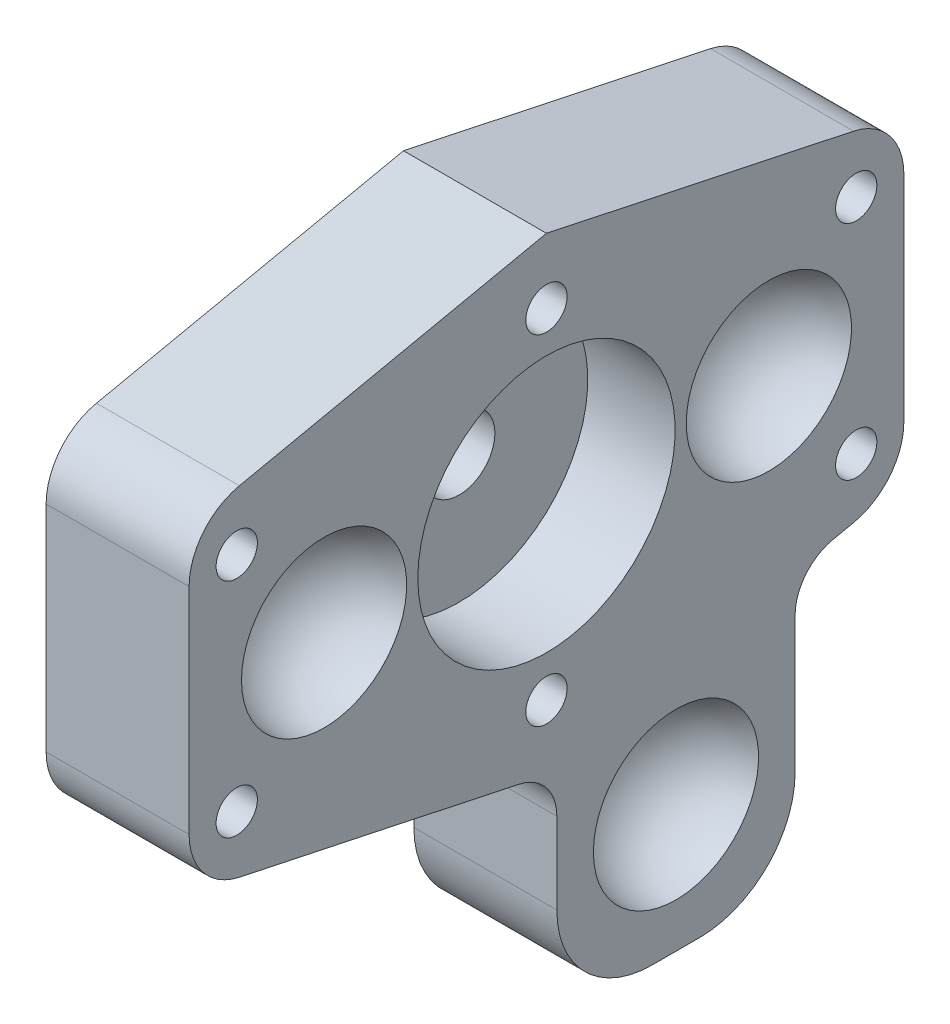
ISO-10303-21;
HEADER;
FILE_DESCRIPTION(('STEP AP214'),'2;1');
FILE_NAME('part.step','',(''),(''),'','','');
FILE_SCHEMA(('AUTOMOTIVE_DESIGN { 1 0 10303 214 1 1 1 1 }'));
ENDSEC;
DATA;
#1=APPLICATION_CONTEXT('core data for automotive mechanical design processes');
#2=APPLICATION_PROTOCOL_DEFINITION('international standard','automotive_design',2000,#1);
#3=PRODUCT_CONTEXT('',#1,'mechanical');
#4=PRODUCT('Part','Part','',(#3));
#5=PRODUCT_RELATED_PRODUCT_CATEGORY('part','',(#4));
#6=PRODUCT_DEFINITION_FORMATION('','',#4);
#7=PRODUCT_DEFINITION_CONTEXT('part definition',#1,'design');
#8=PRODUCT_DEFINITION('design','',#6,#7);
#9=PRODUCT_DEFINITION_SHAPE('','',#8);
#10=(LENGTH_UNIT() NAMED_UNIT(*) SI_UNIT(.MILLI.,.METRE.));
#11=(NAMED_UNIT(*) PLANE_ANGLE_UNIT() SI_UNIT($,.RADIAN.));
#12=(NAMED_UNIT(*) SI_UNIT($,.STERADIAN.) SOLID_ANGLE_UNIT());
#13=UNCERTAINTY_MEASURE_WITH_UNIT(LENGTH_MEASURE(1.E-05),#10,'distance_accuracy_value','');
#14=(GEOMETRIC_REPRESENTATION_CONTEXT(3) GLOBAL_UNCERTAINTY_ASSIGNED_CONTEXT((#13)) GLOBAL_UNIT_ASSIGNED_CONTEXT((#10,
#11,#12)) REPRESENTATION_CONTEXT('',''));
#15=CARTESIAN_POINT('',(0.,0.,0.));
#16=DIRECTION('',(0.,0.,1.));
#17=DIRECTION('',(1.,0.,0.));
#18=AXIS2_PLACEMENT_3D('',#15,#16,#17);
#19=CARTESIAN_POINT('',(-9.,-28.2690306373786,-5.99265255801159));
#20=DIRECTION('',(0.,0.978260869565217,0.207378087264553));
#21=DIRECTION('',(0.,-0.207378087264554,0.978260869565218));
#22=AXIS2_PLACEMENT_3D('',#19,#20,#21);
#23=PLANE('',#22);
#24=DIRECTION('',(0.,0.207378087264554,-0.978260869565218));
#25=VECTOR('',#24,1.);
#26=CARTESIAN_POINT('',(-9.,-28.2690306373786,-5.99265255801159));
#27=LINE('',#26,#25);
#28=CARTESIAN_POINT('',(-9.,-20.9475712012116,-40.5300396512498));
#29=VERTEX_POINT('',#28);
#30=CARTESIAN_POINT('',(-9.,-20.672100546187,-41.8295123490582));
#31=VERTEX_POINT('',#30);
#32=EDGE_CURVE('E195',#29,#31,#27,.T.);
#33=ORIENTED_EDGE('',*,*,#32,.T.);
#34=DIRECTION('',(1.,0.,0.));
#35=VECTOR('',#34,1.);
#36=CARTESIAN_POINT('',(-9.,-20.672100546187,-41.8295123490582));
#37=LINE('',#36,#35);
#38=CARTESIAN_POINT('',(0.,-20.672100546187,-41.8295123490582));
#39=VERTEX_POINT('',#38);
#40=EDGE_CURVE('E279',#39,#31,#37,.F.);
#41=ORIENTED_EDGE('',*,*,#40,.F.);
#42=DIRECTION('',(0.,0.207378087264554,-0.978260869565218));
#43=VECTOR('',#42,1.);
#44=CARTESIAN_POINT('',(0.,-28.2690306373786,-5.99265255801159));
#45=LINE('',#44,#43);
#46=CARTESIAN_POINT('',(0.,-20.9475712012116,-40.5300396512498));
#47=VERTEX_POINT('',#46);
#48=EDGE_CURVE('E228',#47,#39,#45,.T.);
#49=ORIENTED_EDGE('',*,*,#48,.F.);
#50=DIRECTION('',(-1.,0.,0.));
#51=VECTOR('',#50,1.);
#52=CARTESIAN_POINT('',(-9.,-20.9475712012116,-40.5300396512498));
#53=LINE('',#52,#51);
#54=EDGE_CURVE('E303',#29,#47,#53,.F.);
#55=ORIENTED_EDGE('',*,*,#54,.F.);
#56=EDGE_LOOP('',(#33,#41,#49,#55));
#57=FACE_BOUND('',#56,.T.);
#58=ADVANCED_FACE('F37',(#57),#23,.F.);
#59=CARTESIAN_POINT('',(-9.,0.,-45.));
#60=DIRECTION('',(0.,0.,-1.));
#61=DIRECTION('',(1.,0.,0.));
#62=AXIS2_PLACEMENT_3D('',#59,#60,#61);
#63=PLANE('',#62);
#64=DIRECTION('',(0.,-1.,0.));
#65=VECTOR('',#64,1.);
#66=CARTESIAN_POINT('',(-9.,0.,-45.));
#67=LINE('',#66,#65);
#68=CARTESIAN_POINT('',(-9.,-3.24094293207383,-45.));
#69=VERTEX_POINT('',#68);
#70=CARTESIAN_POINT('',(-9.,-16.7590570679262,-45.));
#71=VERTEX_POINT('',#70);
#72=EDGE_CURVE('E183',#69,#71,#67,.T.);
#73=ORIENTED_EDGE('',*,*,#72,.F.);
#74=DIRECTION('',(1.,0.,0.));
#75=VECTOR('',#74,1.);
#76=CARTESIAN_POINT('',(-9.,-3.24094293207383,-45.));
#77=LINE('',#76,#75);
#78=CARTESIAN_POINT('',(0.,-3.24094293207383,-45.));
#79=VERTEX_POINT('',#78);
#80=EDGE_CURVE('E265',#79,#69,#77,.F.);
#81=ORIENTED_EDGE('',*,*,#80,.F.);
#82=DIRECTION('',(0.,-1.,0.));
#83=VECTOR('',#82,1.);
#84=CARTESIAN_POINT('',(0.,0.,-45.));
#85=LINE('',#84,#83);
#86=CARTESIAN_POINT('',(0.,-16.7590570679262,-45.));
#87=VERTEX_POINT('',#86);
#88=EDGE_CURVE('E215',#79,#87,#85,.T.);
#89=ORIENTED_EDGE('',*,*,#88,.T.);
#90=DIRECTION('',(1.,0.,0.));
#91=VECTOR('',#90,1.);
#92=CARTESIAN_POINT('',(0.,-16.7590570679262,-45.));
#93=LINE('',#92,#91);
#94=EDGE_CURVE('E268',#71,#87,#93,.T.);
#95=ORIENTED_EDGE('',*,*,#94,.F.);
#96=EDGE_LOOP('',(#73,#81,#89,#95));
#97=FACE_BOUND('',#96,.T.);
#98=ADVANCED_FACE('F338',(#97),#63,.T.);
#99=CARTESIAN_POINT('',(-9.,9.12914405892871,-1.93525519848772));
#100=DIRECTION('',(0.,0.978260869565217,-0.207378087264554));
#101=DIRECTION('',(0.,0.207378087264554,0.978260869565218));
#102=AXIS2_PLACEMENT_3D('',#99,#100,#101);
#103=PLANE('',#102);
#104=DIRECTION('',(0.,-0.207378087264554,-0.978260869565218));
#105=VECTOR('',#104,1.);
#106=CARTESIAN_POINT('',(-9.,9.12914405892871,-1.93525519848772));
#107=LINE('',#106,#105);
#108=CARTESIAN_POINT('',(-9.,4.76969600708473,-22.5));
#109=VERTEX_POINT('',#108);
#110=CARTESIAN_POINT('',(-9.,0.672100546187042,-41.8295123490582));
#111=VERTEX_POINT('',#110);
#112=EDGE_CURVE('E160',#109,#111,#107,.T.);
#113=ORIENTED_EDGE('',*,*,#112,.F.);
#114=DIRECTION('',(1.,0.,0.));
#115=VECTOR('',#114,1.);
#116=CARTESIAN_POINT('',(-9.,4.76969600708473,-22.5));
#117=LINE('',#116,#115);
#118=CARTESIAN_POINT('',(0.,4.76969600708473,-22.5));
#119=VERTEX_POINT('',#118);
#120=EDGE_CURVE('E169',#109,#119,#117,.T.);
#121=ORIENTED_EDGE('',*,*,#120,.T.);
#122=DIRECTION('',(0.,-0.207378087264554,-0.978260869565218));
#123=VECTOR('',#122,1.);
#124=CARTESIAN_POINT('',(0.,9.12914405892871,-1.93525519848772));
#125=LINE('',#124,#123);
#126=CARTESIAN_POINT('',(0.,0.672100546187042,-41.8295123490582));
#127=VERTEX_POINT('',#126);
#128=EDGE_CURVE('E219',#119,#127,#125,.T.);
#129=ORIENTED_EDGE('',*,*,#128,.T.);
#130=DIRECTION('',(1.,0.,0.));
#131=VECTOR('',#130,1.);
#132=CARTESIAN_POINT('',(-9.,0.672100546187042,-41.8295123490582));
#133=LINE('',#132,#131);
#134=EDGE_CURVE('E182',#111,#127,#133,.T.);
#135=ORIENTED_EDGE('',*,*,#134,.F.);
#136=EDGE_LOOP('',(#113,#121,#129,#135));
#137=FACE_BOUND('',#136,.T.);
#138=ADVANCED_FACE('F180',(#137),#103,.T.);
#139=CARTESIAN_POINT('',(-9.,0.,0.));
#140=DIRECTION('',(0.,-0.978260869565217,-0.207378087264554));
#141=DIRECTION('',(0.,0.207378087264554,-0.978260869565218));
#142=AXIS2_PLACEMENT_3D('',#139,#140,#141);
#143=PLANE('',#142);
#144=DIRECTION('',(0.,-0.207378087264554,0.978260869565218));
#145=VECTOR('',#144,1.);
#146=CARTESIAN_POINT('',(0.,0.,0.));
#147=LINE('',#146,#145);
#148=CARTESIAN_POINT('',(0.,0.672100546187044,-3.17048765094179));
#149=VERTEX_POINT('',#148);
#150=EDGE_CURVE('E172',#119,#149,#147,.T.);
#151=ORIENTED_EDGE('',*,*,#150,.F.);
#152=ORIENTED_EDGE('',*,*,#120,.F.);
#153=DIRECTION('',(0.,-0.207378087264554,0.978260869565218));
#154=VECTOR('',#153,1.);
#155=CARTESIAN_POINT('',(-9.,0.,0.));
#156=LINE('',#155,#154);
#157=CARTESIAN_POINT('',(-9.,0.672100546187044,-3.17048765094179));
#158=VERTEX_POINT('',#157);
#159=EDGE_CURVE('E154',#109,#158,#156,.T.);
#160=ORIENTED_EDGE('',*,*,#159,.T.);
#161=DIRECTION('',(1.,0.,0.));
#162=VECTOR('',#161,1.);
#163=CARTESIAN_POINT('',(-9.,0.672100546187044,-3.17048765094179));
#164=LINE('',#163,#162);
#165=EDGE_CURVE('E296',#149,#158,#164,.F.);
#166=ORIENTED_EDGE('',*,*,#165,.F.);
#167=EDGE_LOOP('',(#151,#152,#160,#166));
#168=FACE_BOUND('',#167,.T.);
#169=ADVANCED_FACE('F170',(#168),#143,.F.);
#170=CARTESIAN_POINT('',(-9.,0.,0.));
#171=DIRECTION('',(0.,0.,-1.));
#172=DIRECTION('',(0.,1.,0.));
#173=AXIS2_PLACEMENT_3D('',#170,#171,#172);
#174=PLANE('',#173);
#175=DIRECTION('',(0.,-1.,0.));
#176=VECTOR('',#175,1.);
#177=CARTESIAN_POINT('',(-9.,0.,0.));
#178=LINE('',#177,#176);
#179=CARTESIAN_POINT('',(-9.,-3.24094293207383,0.));
#180=VERTEX_POINT('',#179);
#181=CARTESIAN_POINT('',(-9.,-16.7590570679262,0.));
#182=VERTEX_POINT('',#181);
#183=EDGE_CURVE('E166',#180,#182,#178,.T.);
#184=ORIENTED_EDGE('',*,*,#183,.T.);
#185=DIRECTION('',(1.,0.,0.));
#186=VECTOR('',#185,1.);
#187=CARTESIAN_POINT('',(-9.,-16.7590570679262,0.));
#188=LINE('',#187,#186);
#189=CARTESIAN_POINT('',(0.,-16.7590570679262,0.));
#190=VERTEX_POINT('',#189);
#191=EDGE_CURVE('E290',#190,#182,#188,.F.);
#192=ORIENTED_EDGE('',*,*,#191,.F.);
#193=DIRECTION('',(0.,-1.,0.));
#194=VECTOR('',#193,1.);
#195=CARTESIAN_POINT('',(0.,0.,0.));
#196=LINE('',#195,#194);
#197=CARTESIAN_POINT('',(0.,-3.24094293207383,0.));
#198=VERTEX_POINT('',#197);
#199=EDGE_CURVE('E222',#198,#190,#196,.T.);
#200=ORIENTED_EDGE('',*,*,#199,.F.);
#201=DIRECTION('',(1.,0.,0.));
#202=VECTOR('',#201,1.);
#203=CARTESIAN_POINT('',(-9.,-3.24094293207383,0.));
#204=LINE('',#203,#202);
#205=EDGE_CURVE('E293',#180,#198,#204,.T.);
#206=ORIENTED_EDGE('',*,*,#205,.F.);
#207=EDGE_LOOP('',(#184,#192,#200,#206));
#208=FACE_BOUND('',#207,.T.);
#209=ADVANCED_FACE('F324',(#208),#174,.F.);
#210=CARTESIAN_POINT('',(-9.,-19.1398865784499,4.05739735952387));
#211=DIRECTION('',(0.,0.978260869565217,-0.207378087264553));
#212=DIRECTION('',(0.,0.207378087264554,0.978260869565218));
#213=AXIS2_PLACEMENT_3D('',#210,#211,#212);
#214=PLANE('',#213);
#215=DIRECTION('',(0.,-0.207378087264554,-0.978260869565218));
#216=VECTOR('',#215,1.);
#217=CARTESIAN_POINT('',(0.,-19.1398865784499,4.05739735952387));
#218=LINE('',#217,#216);
#219=CARTESIAN_POINT('',(0.,-20.672100546187,-3.17048765094179));
#220=VERTEX_POINT('',#219);
#221=CARTESIAN_POINT('',(0.,-24.4038726556208,-20.7743081748371));
#222=VERTEX_POINT('',#221);
#223=EDGE_CURVE('E225',#220,#222,#218,.T.);
#224=ORIENTED_EDGE('',*,*,#223,.F.);
#225=DIRECTION('',(1.,0.,0.));
#226=VECTOR('',#225,1.);
#227=CARTESIAN_POINT('',(-9.,-20.672100546187,-3.17048765094179));
#228=LINE('',#227,#226);
#229=CARTESIAN_POINT('',(-9.,-20.672100546187,-3.17048765094179));
#230=VERTEX_POINT('',#229);
#231=EDGE_CURVE('E298',#230,#220,#228,.T.);
#232=ORIENTED_EDGE('',*,*,#231,.F.);
#233=DIRECTION('',(0.,-0.207378087264554,-0.978260869565218));
#234=VECTOR('',#233,1.);
#235=CARTESIAN_POINT('',(-9.,-19.1398865784499,4.05739735952387));
#236=LINE('',#235,#234);
#237=CARTESIAN_POINT('',(-9.,-24.4038726556208,-20.7743081748371));
#238=VERTEX_POINT('',#237);
#239=EDGE_CURVE('E192',#230,#238,#236,.T.);
#240=ORIENTED_EDGE('',*,*,#239,.T.);
#241=DIRECTION('',(1.,0.,0.));
#242=VECTOR('',#241,1.);
#243=CARTESIAN_POINT('',(-9.,-24.4038726556208,-20.7743081748371));
#244=LINE('',#243,#242);
#245=EDGE_CURVE('E313',#222,#238,#244,.F.);
#246=ORIENTED_EDGE('',*,*,#245,.F.);
#247=EDGE_LOOP('',(#224,#232,#240,#246));
#248=FACE_BOUND('',#247,.T.);
#249=ADVANCED_FACE('F317',(#248),#214,.F.);
#250=CARTESIAN_POINT('',(-9.,-17.0000000000008,-3.));
#251=DIRECTION('',(1.,0.,0.));
#252=DIRECTION('',(0.,0.,1.));
#253=AXIS2_PLACEMENT_3D('',#250,#251,#252);
#254=CYLINDRICAL_SURFACE('',#253,1.3);
#255=CARTESIAN_POINT('',(-9.,-17.0000000000008,-3.));
#256=DIRECTION('',(1.,0.,0.));
#257=DIRECTION('',(0.,0.,-1.));
#258=AXIS2_PLACEMENT_3D('',#255,#256,#257);
#259=CIRCLE('',#258,1.3);
#260=CARTESIAN_POINT('',(-9.,-17.0000000000008,-4.3));
#261=VERTEX_POINT('',#260);
#262=EDGE_CURVE('E207',#261,#261,#259,.T.);
#263=ORIENTED_EDGE('',*,*,#262,.F.);
#264=EDGE_LOOP('',(#263));
#265=FACE_BOUND('',#264,.T.);
#266=CARTESIAN_POINT('',(0.,-17.0000000000008,-3.));
#267=DIRECTION('',(1.,0.,0.));
#268=DIRECTION('',(0.,0.,-1.));
#269=AXIS2_PLACEMENT_3D('',#266,#267,#268);
#270=CIRCLE('',#269,1.3);
#271=CARTESIAN_POINT('',(0.,-17.0000000000008,-4.3));
#272=VERTEX_POINT('',#271);
#273=EDGE_CURVE('E240',#272,#272,#270,.T.);
#274=ORIENTED_EDGE('',*,*,#273,.T.);
#275=EDGE_LOOP('',(#274));
#276=FACE_BOUND('',#275,.T.);
#277=ADVANCED_FACE('F420',(#265,#276),#254,.F.);
#278=CARTESIAN_POINT('',(-9.,-3.00000000000081,-2.99999999999995));
#279=DIRECTION('',(1.,0.,0.));
#280=DIRECTION('',(0.,0.,1.));
#281=AXIS2_PLACEMENT_3D('',#278,#279,#280);
#282=CYLINDRICAL_SURFACE('',#281,1.3);
#283=CARTESIAN_POINT('',(-9.,-3.00000000000081,-2.99999999999995));
#284=DIRECTION('',(1.,0.,0.));
#285=DIRECTION('',(0.,0.,-1.));
#286=AXIS2_PLACEMENT_3D('',#283,#284,#285);
#287=CIRCLE('',#286,1.3);
#288=CARTESIAN_POINT('',(-9.,-3.00000000000081,-4.29999999999995));
#289=VERTEX_POINT('',#288);
#290=EDGE_CURVE('E204',#289,#289,#287,.T.);
#291=ORIENTED_EDGE('',*,*,#290,.F.);
#292=EDGE_LOOP('',(#291));
#293=FACE_BOUND('',#292,.T.);
#294=CARTESIAN_POINT('',(0.,-3.00000000000081,-2.99999999999995));
#295=DIRECTION('',(1.,0.,0.));
#296=DIRECTION('',(0.,0.,-1.));
#297=AXIS2_PLACEMENT_3D('',#294,#295,#296);
#298=CIRCLE('',#297,1.3);
#299=CARTESIAN_POINT('',(0.,-3.00000000000081,-4.29999999999995));
#300=VERTEX_POINT('',#299);
#301=EDGE_CURVE('E237',#300,#300,#298,.T.);
#302=ORIENTED_EDGE('',*,*,#301,.T.);
#303=EDGE_LOOP('',(#302));
#304=FACE_BOUND('',#303,.T.);
#305=ADVANCED_FACE('F635',(#293,#304),#282,.F.);
#306=CARTESIAN_POINT('',(-9.,-3.,-42.));
#307=DIRECTION('',(1.,0.,0.));
#308=DIRECTION('',(0.,0.,1.));
#309=AXIS2_PLACEMENT_3D('',#306,#307,#308);
#310=CYLINDRICAL_SURFACE('',#309,1.3);
#311=CARTESIAN_POINT('',(-9.,-3.,-42.));
#312=DIRECTION('',(1.,0.,0.));
#313=DIRECTION('',(0.,0.,-1.));
#314=AXIS2_PLACEMENT_3D('',#311,#312,#313);
#315=CIRCLE('',#314,1.3);
#316=CARTESIAN_POINT('',(-9.,-3.,-43.2999999999999));
#317=VERTEX_POINT('',#316);
#318=EDGE_CURVE('E201',#317,#317,#315,.T.);
#319=ORIENTED_EDGE('',*,*,#318,.F.);
#320=EDGE_LOOP('',(#319));
#321=FACE_BOUND('',#320,.T.);
#322=CARTESIAN_POINT('',(0.,-3.,-42.));
#323=DIRECTION('',(1.,0.,0.));
#324=DIRECTION('',(0.,0.,-1.));
#325=AXIS2_PLACEMENT_3D('',#322,#323,#324);
#326=CIRCLE('',#325,1.3);
#327=CARTESIAN_POINT('',(0.,-3.,-43.2999999999999));
#328=VERTEX_POINT('',#327);
#329=EDGE_CURVE('E234',#328,#328,#326,.T.);
#330=ORIENTED_EDGE('',*,*,#329,.T.);
#331=EDGE_LOOP('',(#330));
#332=FACE_BOUND('',#331,.T.);
#333=ADVANCED_FACE('F626',(#321,#332),#310,.F.);
#334=CARTESIAN_POINT('',(-9.,0.680807118195843,-22.5));
#335=DIRECTION('',(1.,0.,0.));
#336=DIRECTION('',(0.,0.,1.));
#337=AXIS2_PLACEMENT_3D('',#334,#335,#336);
#338=CYLINDRICAL_SURFACE('',#337,1.3);
#339=CARTESIAN_POINT('',(-9.,0.680807118195843,-22.5));
#340=DIRECTION('',(1.,0.,0.));
#341=DIRECTION('',(0.,0.,-1.));
#342=AXIS2_PLACEMENT_3D('',#339,#340,#341);
#343=CIRCLE('',#342,1.3);
#344=CARTESIAN_POINT('',(-9.,0.680807118195843,-23.8));
#345=VERTEX_POINT('',#344);
#346=EDGE_CURVE('E198',#345,#345,#343,.T.);
#347=ORIENTED_EDGE('',*,*,#346,.F.);
#348=EDGE_LOOP('',(#347));
#349=FACE_BOUND('',#348,.T.);
#350=CARTESIAN_POINT('',(0.,0.680807118195843,-22.5));
#351=DIRECTION('',(1.,0.,0.));
#352=DIRECTION('',(0.,0.,-1.));
#353=AXIS2_PLACEMENT_3D('',#350,#351,#352);
#354=CIRCLE('',#353,1.3);
#355=CARTESIAN_POINT('',(0.,0.680807118195843,-23.8));
#356=VERTEX_POINT('',#355);
#357=EDGE_CURVE('E231',#356,#356,#354,.T.);
#358=ORIENTED_EDGE('',*,*,#357,.T.);
#359=EDGE_LOOP('',(#358));
#360=FACE_BOUND('',#359,.T.);
#361=ADVANCED_FACE('F389',(#349,#360),#338,.F.);
#362=CARTESIAN_POINT('',(-9.,-20.6808071181958,-22.5));
#363=DIRECTION('',(1.,0.,0.));
#364=DIRECTION('',(0.,0.,1.));
#365=AXIS2_PLACEMENT_3D('',#362,#363,#364);
#366=CYLINDRICAL_SURFACE('',#365,1.3);
#367=CARTESIAN_POINT('',(-9.,-20.6808071181958,-22.5));
#368=DIRECTION('',(1.,0.,0.));
#369=DIRECTION('',(0.,0.,-1.));
#370=AXIS2_PLACEMENT_3D('',#367,#368,#369);
#371=CIRCLE('',#370,1.3);
#372=CARTESIAN_POINT('',(-9.,-20.6808071181958,-23.8));
#373=VERTEX_POINT('',#372);
#374=EDGE_CURVE('E186',#373,#373,#371,.T.);
#375=ORIENTED_EDGE('',*,*,#374,.F.);
#376=EDGE_LOOP('',(#375));
#377=FACE_BOUND('',#376,.T.);
#378=CARTESIAN_POINT('',(0.,-20.6808071181958,-22.5));
#379=DIRECTION('',(1.,0.,0.));
#380=DIRECTION('',(0.,0.,-1.));
#381=AXIS2_PLACEMENT_3D('',#378,#379,#380);
#382=CIRCLE('',#381,1.3);
#383=CARTESIAN_POINT('',(0.,-20.6808071181958,-23.8));
#384=VERTEX_POINT('',#383);
#385=EDGE_CURVE('E212',#384,#384,#382,.T.);
#386=ORIENTED_EDGE('',*,*,#385,.T.);
#387=EDGE_LOOP('',(#386));
#388=FACE_BOUND('',#387,.T.);
#389=ADVANCED_FACE('F385',(#377,#388),#366,.F.);
#390=CARTESIAN_POINT('',(-9.,-17.,-42.));
#391=DIRECTION('',(1.,0.,0.));
#392=DIRECTION('',(0.,0.,1.));
#393=AXIS2_PLACEMENT_3D('',#390,#391,#392);
#394=CYLINDRICAL_SURFACE('',#393,1.3);
#395=CARTESIAN_POINT('',(-9.,-17.,-42.));
#396=DIRECTION('',(1.,0.,0.));
#397=DIRECTION('',(0.,0.,-1.));
#398=AXIS2_PLACEMENT_3D('',#395,#396,#397);
#399=CIRCLE('',#398,1.3);
#400=CARTESIAN_POINT('',(-9.,-17.,-43.3));
#401=VERTEX_POINT('',#400);
#402=EDGE_CURVE('E177',#401,#401,#399,.T.);
#403=ORIENTED_EDGE('',*,*,#402,.F.);
#404=EDGE_LOOP('',(#403));
#405=FACE_BOUND('',#404,.T.);
#406=CARTESIAN_POINT('',(0.,-17.,-42.));
#407=DIRECTION('',(1.,0.,0.));
#408=DIRECTION('',(0.,0.,-1.));
#409=AXIS2_PLACEMENT_3D('',#406,#407,#408);
#410=CIRCLE('',#409,1.3);
#411=CARTESIAN_POINT('',(0.,-17.,-43.3));
#412=VERTEX_POINT('',#411);
#413=EDGE_CURVE('E243',#412,#412,#410,.T.);
#414=ORIENTED_EDGE('',*,*,#413,.T.);
#415=EDGE_LOOP('',(#414));
#416=FACE_BOUND('',#415,.T.);
#417=ADVANCED_FACE('F388',(#405,#416),#394,.F.);
#418=CARTESIAN_POINT('',(-9.,0.,0.));
#419=DIRECTION('',(-1.,0.,0.));
#420=DIRECTION('',(0.,0.,-1.));
#421=AXIS2_PLACEMENT_3D('',#418,#419,#420);
#422=PLANE('',#421);
#423=CARTESIAN_POINT('',(-9.,-10.,-22.5));
#424=DIRECTION('',(-1.,0.,0.));
#425=DIRECTION('',(0.,0.,1.));
#426=AXIS2_PLACEMENT_3D('',#423,#424,#425);
#427=CIRCLE('',#426,2.25);
#428=CARTESIAN_POINT('',(-9.,-10.,-20.25));
#429=VERTEX_POINT('',#428);
#430=EDGE_CURVE('E364',#429,#429,#427,.T.);
#431=ORIENTED_EDGE('',*,*,#430,.F.);
#432=EDGE_LOOP('',(#431));
#433=FACE_BOUND('',#432,.T.);
#434=ORIENTED_EDGE('',*,*,#374,.T.);
#435=EDGE_LOOP('',(#434));
#436=FACE_BOUND('',#435,.T.);
#437=DIRECTION('',(0.,1.,0.));
#438=VECTOR('',#437,1.);
#439=CARTESIAN_POINT('',(-9.,-21.4516466108519,-38.1521739130435));
#440=LINE('',#439,#438);
#441=CARTESIAN_POINT('',(-9.,-32.4516466108519,-38.1521739130435));
#442=VERTEX_POINT('',#441);
#443=CARTESIAN_POINT('',(-9.,-23.8823538099072,-38.1521739130435));
#444=VERTEX_POINT('',#443);
#445=EDGE_CURVE('E348',#442,#444,#440,.T.);
#446=ORIENTED_EDGE('',*,*,#445,.F.);
#447=CARTESIAN_POINT('',(-9.,-32.4516466108519,-32.1521739130435));
#448=DIRECTION('',(1.,0.,0.));
#449=DIRECTION('',(0.,0.,-1.));
#450=AXIS2_PLACEMENT_3D('',#447,#448,#449);
#451=CIRCLE('',#450,6.);
#452=CARTESIAN_POINT('',(-9.,-38.4516466108519,-32.1521739130435));
#453=VERTEX_POINT('',#452);
#454=EDGE_CURVE('E247',#453,#442,#451,.T.);
#455=ORIENTED_EDGE('',*,*,#454,.F.);
#456=DIRECTION('',(0.,0.,-1.));
#457=VECTOR('',#456,1.);
#458=CARTESIAN_POINT('',(-9.,-38.4516466108519,-38.1521739130435));
#459=LINE('',#458,#457);
#460=CARTESIAN_POINT('',(-9.,-38.4516466108519,-29.1521739130435));
#461=VERTEX_POINT('',#460);
#462=EDGE_CURVE('E354',#461,#453,#459,.T.);
#463=ORIENTED_EDGE('',*,*,#462,.F.);
#464=CARTESIAN_POINT('',(-9.,-32.4516466108519,-29.1521739130435));
#465=DIRECTION('',(1.,0.,0.));
#466=DIRECTION('',(0.,0.,-1.));
#467=AXIS2_PLACEMENT_3D('',#464,#465,#466);
#468=CIRCLE('',#467,6.);
#469=CARTESIAN_POINT('',(-9.,-32.4516466108519,-23.1521739130435));
#470=VERTEX_POINT('',#469);
#471=EDGE_CURVE('E250',#470,#461,#468,.T.);
#472=ORIENTED_EDGE('',*,*,#471,.F.);
#473=DIRECTION('',(0.,-1.,0.));
#474=VECTOR('',#473,1.);
#475=CARTESIAN_POINT('',(-9.,-38.4516466108519,-23.1521739130435));
#476=LINE('',#475,#474);
#477=CARTESIAN_POINT('',(-9.,-27.3386552643165,-23.1521739130435));
#478=VERTEX_POINT('',#477);
#479=EDGE_CURVE('E360',#478,#470,#476,.T.);
#480=ORIENTED_EDGE('',*,*,#479,.F.);
#481=CARTESIAN_POINT('',(-9.,-27.3386552643165,-20.1521739130435));
#482=DIRECTION('',(1.,0.,0.));
#483=DIRECTION('',(0.,0.,-1.));
#484=AXIS2_PLACEMENT_3D('',#481,#482,#483);
#485=CIRCLE('',#484,3.);
#486=EDGE_CURVE('E11',#238,#478,#485,.F.);
#487=ORIENTED_EDGE('',*,*,#486,.F.);
#488=ORIENTED_EDGE('',*,*,#239,.F.);
#489=CARTESIAN_POINT('',(-9.,-16.7590570679262,-4.));
#490=DIRECTION('',(1.,0.,0.));
#491=DIRECTION('',(0.,0.,-1.));
#492=AXIS2_PLACEMENT_3D('',#489,#490,#491);
#493=CIRCLE('',#492,4.);
#494=EDGE_CURVE('E282',#182,#230,#493,.T.);
#495=ORIENTED_EDGE('',*,*,#494,.F.);
#496=ORIENTED_EDGE('',*,*,#183,.F.);
#497=CARTESIAN_POINT('',(-9.,-3.24094293207383,-4.));
#498=DIRECTION('',(1.,0.,0.));
#499=DIRECTION('',(0.,0.,-1.));
#500=AXIS2_PLACEMENT_3D('',#497,#498,#499);
#501=CIRCLE('',#500,4.);
#502=EDGE_CURVE('E162',#158,#180,#501,.T.);
#503=ORIENTED_EDGE('',*,*,#502,.F.);
#504=ORIENTED_EDGE('',*,*,#159,.F.);
#505=ORIENTED_EDGE('',*,*,#112,.T.);
#506=CARTESIAN_POINT('',(-9.,-3.24094293207383,-41.));
#507=DIRECTION('',(1.,0.,0.));
#508=DIRECTION('',(0.,0.,-1.));
#509=AXIS2_PLACEMENT_3D('',#506,#507,#508);
#510=CIRCLE('',#509,4.);
#511=EDGE_CURVE('E285',#69,#111,#510,.T.);
#512=ORIENTED_EDGE('',*,*,#511,.F.);
#513=ORIENTED_EDGE('',*,*,#72,.T.);
#514=CARTESIAN_POINT('',(-9.,-16.7590570679262,-41.));
#515=DIRECTION('',(1.,0.,0.));
#516=DIRECTION('',(0.,0.,-1.));
#517=AXIS2_PLACEMENT_3D('',#514,#515,#516);
#518=CIRCLE('',#517,4.);
#519=EDGE_CURVE('E287',#31,#71,#518,.T.);
#520=ORIENTED_EDGE('',*,*,#519,.F.);
#521=ORIENTED_EDGE('',*,*,#32,.F.);
#522=CARTESIAN_POINT('',(-9.,-23.8823538099072,-41.1521739130435));
#523=DIRECTION('',(1.,0.,0.));
#524=DIRECTION('',(0.,0.,-1.));
#525=AXIS2_PLACEMENT_3D('',#522,#523,#524);
#526=CIRCLE('',#525,3.);
#527=EDGE_CURVE('E306',#444,#29,#526,.F.);
#528=ORIENTED_EDGE('',*,*,#527,.F.);
#529=EDGE_LOOP('',(#446,#455,#463,#472,#480,#487,#488,#495,#496,#503,#504,#505,#512,#513,#520,
#521,#528));
#530=FACE_BOUND('',#529,.T.);
#531=ORIENTED_EDGE('',*,*,#346,.T.);
#532=EDGE_LOOP('',(#531));
#533=FACE_BOUND('',#532,.T.);
#534=ORIENTED_EDGE('',*,*,#318,.T.);
#535=EDGE_LOOP('',(#534));
#536=FACE_BOUND('',#535,.T.);
#537=ORIENTED_EDGE('',*,*,#290,.T.);
#538=EDGE_LOOP('',(#537));
#539=FACE_BOUND('',#538,.T.);
#540=ORIENTED_EDGE('',*,*,#262,.T.);
#541=EDGE_LOOP('',(#540));
#542=FACE_BOUND('',#541,.T.);
#543=ORIENTED_EDGE('',*,*,#402,.T.);
#544=EDGE_LOOP('',(#543));
#545=FACE_BOUND('',#544,.T.);
#546=ADVANCED_FACE('F157',(#433,#436,#530,#533,#536,#539,#542,#545),#422,.T.);
#547=CARTESIAN_POINT('',(0.,0.,0.));
#548=DIRECTION('',(-1.,0.,0.));
#549=DIRECTION('',(0.,0.,-1.));
#550=AXIS2_PLACEMENT_3D('',#547,#548,#549);
#551=PLANE('',#550);
#552=CARTESIAN_POINT('',(0.,-30.4516466108519,-30.6521739130435));
#553=DIRECTION('',(1.,0.,0.));
#554=DIRECTION('',(0.,0.,1.));
#555=AXIS2_PLACEMENT_3D('',#552,#553,#554);
#556=CIRCLE('',#555,5.2);
#557=CARTESIAN_POINT('',(0.,-30.4516466108519,-25.4521739130435));
#558=VERTEX_POINT('',#557);
#559=EDGE_CURVE('E454',#558,#558,#556,.T.);
#560=ORIENTED_EDGE('',*,*,#559,.F.);
#561=EDGE_LOOP('',(#560));
#562=FACE_BOUND('',#561,.T.);
#563=CARTESIAN_POINT('',(0.,-10.,-22.5));
#564=DIRECTION('',(-1.,0.,0.));
#565=DIRECTION('',(0.,0.,1.));
#566=AXIS2_PLACEMENT_3D('',#563,#564,#565);
#567=CIRCLE('',#566,8.1);
#568=CARTESIAN_POINT('',(0.,-10.,-14.4));
#569=VERTEX_POINT('',#568);
#570=EDGE_CURVE('E367',#569,#569,#567,.T.);
#571=ORIENTED_EDGE('',*,*,#570,.T.);
#572=EDGE_LOOP('',(#571));
#573=FACE_BOUND('',#572,.T.);
#574=CARTESIAN_POINT('',(0.,-10.,-8.5));
#575=DIRECTION('',(1.,0.,0.));
#576=DIRECTION('',(0.,0.,1.));
#577=AXIS2_PLACEMENT_3D('',#574,#575,#576);
#578=CIRCLE('',#577,5.2);
#579=CARTESIAN_POINT('',(0.,-10.,-3.29999999999999));
#580=VERTEX_POINT('',#579);
#581=EDGE_CURVE('E375',#580,#580,#578,.T.);
#582=ORIENTED_EDGE('',*,*,#581,.F.);
#583=EDGE_LOOP('',(#582));
#584=FACE_BOUND('',#583,.T.);
#585=CARTESIAN_POINT('',(0.,-10.,-36.5));
#586=DIRECTION('',(1.,0.,0.));
#587=DIRECTION('',(0.,0.,1.));
#588=AXIS2_PLACEMENT_3D('',#585,#586,#587);
#589=CIRCLE('',#588,5.2);
#590=CARTESIAN_POINT('',(0.,-10.,-31.3));
#591=VERTEX_POINT('',#590);
#592=EDGE_CURVE('E216',#591,#591,#589,.T.);
#593=ORIENTED_EDGE('',*,*,#592,.F.);
#594=EDGE_LOOP('',(#593));
#595=FACE_BOUND('',#594,.T.);
#596=ORIENTED_EDGE('',*,*,#385,.F.);
#597=EDGE_LOOP('',(#596));
#598=FACE_BOUND('',#597,.T.);
#599=ORIENTED_EDGE('',*,*,#88,.F.);
#600=CARTESIAN_POINT('',(0.,-3.24094293207383,-41.));
#601=DIRECTION('',(1.,0.,0.));
#602=DIRECTION('',(0.,0.,-1.));
#603=AXIS2_PLACEMENT_3D('',#600,#601,#602);
#604=CIRCLE('',#603,4.);
#605=EDGE_CURVE('E275',#127,#79,#604,.F.);
#606=ORIENTED_EDGE('',*,*,#605,.F.);
#607=ORIENTED_EDGE('',*,*,#128,.F.);
#608=ORIENTED_EDGE('',*,*,#150,.T.);
#609=CARTESIAN_POINT('',(0.,-3.24094293207383,-4.));
#610=DIRECTION('',(1.,0.,0.));
#611=DIRECTION('',(0.,0.,-1.));
#612=AXIS2_PLACEMENT_3D('',#609,#610,#611);
#613=CIRCLE('',#612,4.);
#614=EDGE_CURVE('E273',#198,#149,#613,.F.);
#615=ORIENTED_EDGE('',*,*,#614,.F.);
#616=ORIENTED_EDGE('',*,*,#199,.T.);
#617=CARTESIAN_POINT('',(0.,-16.7590570679262,-4.));
#618=DIRECTION('',(1.,0.,0.));
#619=DIRECTION('',(0.,0.,-1.));
#620=AXIS2_PLACEMENT_3D('',#617,#618,#619);
#621=CIRCLE('',#620,4.);
#622=EDGE_CURVE('E271',#220,#190,#621,.F.);
#623=ORIENTED_EDGE('',*,*,#622,.F.);
#624=ORIENTED_EDGE('',*,*,#223,.T.);
#625=CARTESIAN_POINT('',(0.,-27.3386552643165,-20.1521739130435));
#626=DIRECTION('',(1.,0.,0.));
#627=DIRECTION('',(0.,0.,-1.));
#628=AXIS2_PLACEMENT_3D('',#625,#626,#627);
#629=CIRCLE('',#628,3.);
#630=CARTESIAN_POINT('',(0.,-27.3386552643165,-23.1521739130435));
#631=VERTEX_POINT('',#630);
#632=EDGE_CURVE('E45',#631,#222,#629,.T.);
#633=ORIENTED_EDGE('',*,*,#632,.F.);
#634=DIRECTION('',(0.,-1.,0.));
#635=VECTOR('',#634,1.);
#636=CARTESIAN_POINT('',(0.,-38.4516466108519,-23.1521739130435));
#637=LINE('',#636,#635);
#638=CARTESIAN_POINT('',(0.,-32.4516466108519,-23.1521739130435));
#639=VERTEX_POINT('',#638);
#640=EDGE_CURVE('E353',#631,#639,#637,.T.);
#641=ORIENTED_EDGE('',*,*,#640,.T.);
#642=CARTESIAN_POINT('',(0.,-32.4516466108519,-29.1521739130435));
#643=DIRECTION('',(1.,0.,0.));
#644=DIRECTION('',(0.,0.,-1.));
#645=AXIS2_PLACEMENT_3D('',#642,#643,#644);
#646=CIRCLE('',#645,6.);
#647=CARTESIAN_POINT('',(0.,-38.4516466108519,-29.1521739130435));
#648=VERTEX_POINT('',#647);
#649=EDGE_CURVE('E260',#648,#639,#646,.F.);
#650=ORIENTED_EDGE('',*,*,#649,.F.);
#651=DIRECTION('',(0.,0.,-1.));
#652=VECTOR('',#651,1.);
#653=CARTESIAN_POINT('',(0.,-38.4516466108519,-38.1521739130435));
#654=LINE('',#653,#652);
#655=CARTESIAN_POINT('',(0.,-38.4516466108519,-32.1521739130435));
#656=VERTEX_POINT('',#655);
#657=EDGE_CURVE('E357',#648,#656,#654,.T.);
#658=ORIENTED_EDGE('',*,*,#657,.T.);
#659=CARTESIAN_POINT('',(0.,-32.4516466108519,-32.1521739130435));
#660=DIRECTION('',(1.,0.,0.));
#661=DIRECTION('',(0.,0.,-1.));
#662=AXIS2_PLACEMENT_3D('',#659,#660,#661);
#663=CIRCLE('',#662,6.);
#664=CARTESIAN_POINT('',(0.,-32.4516466108519,-38.1521739130435));
#665=VERTEX_POINT('',#664);
#666=EDGE_CURVE('E257',#665,#656,#663,.F.);
#667=ORIENTED_EDGE('',*,*,#666,.F.);
#668=DIRECTION('',(0.,1.,0.));
#669=VECTOR('',#668,1.);
#670=CARTESIAN_POINT('',(0.,-21.4516466108519,-38.1521739130435));
#671=LINE('',#670,#669);
#672=CARTESIAN_POINT('',(0.,-23.8823538099072,-38.1521739130435));
#673=VERTEX_POINT('',#672);
#674=EDGE_CURVE('E371',#665,#673,#671,.T.);
#675=ORIENTED_EDGE('',*,*,#674,.T.);
#676=CARTESIAN_POINT('',(0.,-23.8823538099072,-41.1521739130435));
#677=DIRECTION('',(1.,0.,0.));
#678=DIRECTION('',(0.,0.,-1.));
#679=AXIS2_PLACEMENT_3D('',#676,#677,#678);
#680=CIRCLE('',#679,3.);
#681=EDGE_CURVE('E308',#47,#673,#680,.T.);
#682=ORIENTED_EDGE('',*,*,#681,.F.);
#683=ORIENTED_EDGE('',*,*,#48,.T.);
#684=CARTESIAN_POINT('',(0.,-16.7590570679262,-41.));
#685=DIRECTION('',(1.,0.,0.));
#686=DIRECTION('',(0.,0.,-1.));
#687=AXIS2_PLACEMENT_3D('',#684,#685,#686);
#688=CIRCLE('',#687,4.);
#689=EDGE_CURVE('E277',#87,#39,#688,.F.);
#690=ORIENTED_EDGE('',*,*,#689,.F.);
#691=EDGE_LOOP('',(#599,#606,#607,#608,#615,#616,#623,#624,#633,#641,#650,#658,#667,#675,#682,
#683,#690));
#692=FACE_BOUND('',#691,.T.);
#693=ORIENTED_EDGE('',*,*,#357,.F.);
#694=EDGE_LOOP('',(#693));
#695=FACE_BOUND('',#694,.T.);
#696=ORIENTED_EDGE('',*,*,#329,.F.);
#697=EDGE_LOOP('',(#696));
#698=FACE_BOUND('',#697,.T.);
#699=ORIENTED_EDGE('',*,*,#301,.F.);
#700=EDGE_LOOP('',(#699));
#701=FACE_BOUND('',#700,.T.);
#702=ORIENTED_EDGE('',*,*,#273,.F.);
#703=EDGE_LOOP('',(#702));
#704=FACE_BOUND('',#703,.T.);
#705=ORIENTED_EDGE('',*,*,#413,.F.);
#706=EDGE_LOOP('',(#705));
#707=FACE_BOUND('',#706,.T.);
#708=ADVANCED_FACE('F329',(#562,#573,#584,#595,#598,#692,#695,#698,#701,#704,#707),#551,.F.);
#709=CARTESIAN_POINT('',(0.,-10.,-36.5));
#710=DIRECTION('',(0.,0.,1.));
#711=DIRECTION('',(0.,1.,0.));
#712=AXIS2_PLACEMENT_3D('',#709,#710,#711);
#713=SPHERICAL_SURFACE('',#712,5.2);
#714=CARTESIAN_POINT('',(0.,-10.,-36.5));
#715=DIRECTION('',(1.,0.,0.));
#716=DIRECTION('',(0.,0.,1.));
#717=AXIS2_PLACEMENT_3D('',#714,#715,#716);
#718=SPHERICAL_SURFACE('',#717,5.2);
#719=ORIENTED_EDGE('',*,*,#592,.T.);
#720=EDGE_LOOP('',(#719));
#721=FACE_BOUND('',#720,.T.);
#722=ADVANCED_FACE('F394',(#721),#718,.F.);
#723=CARTESIAN_POINT('',(0.,-10.,-8.5));
#724=DIRECTION('',(0.,0.,1.));
#725=DIRECTION('',(0.,1.,0.));
#726=AXIS2_PLACEMENT_3D('',#723,#724,#725);
#727=SPHERICAL_SURFACE('',#726,5.2);
#728=CARTESIAN_POINT('',(0.,-10.,-8.5));
#729=DIRECTION('',(1.,0.,0.));
#730=DIRECTION('',(0.,0.,1.));
#731=AXIS2_PLACEMENT_3D('',#728,#729,#730);
#732=SPHERICAL_SURFACE('',#731,5.2);
#733=ORIENTED_EDGE('',*,*,#581,.T.);
#734=EDGE_LOOP('',(#733));
#735=FACE_BOUND('',#734,.T.);
#736=ADVANCED_FACE('F401',(#735),#732,.F.);
#737=CARTESIAN_POINT('',(-5.5,-10.,-22.5));
#738=DIRECTION('',(1.,0.,0.));
#739=DIRECTION('',(0.,0.,1.));
#740=AXIS2_PLACEMENT_3D('',#737,#738,#739);
#741=CYLINDRICAL_SURFACE('',#740,8.1);
#742=CARTESIAN_POINT('',(-5.5,-10.,-22.5));
#743=DIRECTION('',(-1.,0.,0.));
#744=DIRECTION('',(0.,0.,1.));
#745=AXIS2_PLACEMENT_3D('',#742,#743,#744);
#746=CIRCLE('',#745,8.1);
#747=CARTESIAN_POINT('',(-5.5,-10.,-14.4));
#748=VERTEX_POINT('',#747);
#749=EDGE_CURVE('E372',#748,#748,#746,.T.);
#750=ORIENTED_EDGE('',*,*,#749,.T.);
#751=EDGE_LOOP('',(#750));
#752=FACE_BOUND('',#751,.T.);
#753=ORIENTED_EDGE('',*,*,#570,.F.);
#754=EDGE_LOOP('',(#753));
#755=FACE_BOUND('',#754,.T.);
#756=ADVANCED_FACE('F481',(#752,#755),#741,.F.);
#757=CARTESIAN_POINT('',(-5.5,-10.,-22.5));
#758=DIRECTION('',(1.,0.,0.));
#759=DIRECTION('',(0.,0.,1.));
#760=AXIS2_PLACEMENT_3D('',#757,#758,#759);
#761=PLANE('',#760);
#762=CARTESIAN_POINT('',(-5.5,-10.,-22.5));
#763=DIRECTION('',(-1.,0.,0.));
#764=DIRECTION('',(0.,0.,1.));
#765=AXIS2_PLACEMENT_3D('',#762,#763,#764);
#766=CIRCLE('',#765,2.25);
#767=CARTESIAN_POINT('',(-5.5,-10.,-20.25));
#768=VERTEX_POINT('',#767);
#769=EDGE_CURVE('E368',#768,#768,#766,.T.);
#770=ORIENTED_EDGE('',*,*,#769,.T.);
#771=EDGE_LOOP('',(#770));
#772=FACE_BOUND('',#771,.T.);
#773=ORIENTED_EDGE('',*,*,#749,.F.);
#774=EDGE_LOOP('',(#773));
#775=FACE_BOUND('',#774,.T.);
#776=ADVANCED_FACE('F477',(#772,#775),#761,.T.);
#777=CARTESIAN_POINT('',(-9.,-10.,-22.5));
#778=DIRECTION('',(1.,0.,0.));
#779=DIRECTION('',(0.,0.,1.));
#780=AXIS2_PLACEMENT_3D('',#777,#778,#779);
#781=CYLINDRICAL_SURFACE('',#780,2.25);
#782=CARTESIAN_POINT('',(-9.,-10.,-20.25));
#783=CARTESIAN_POINT('',(-8.96354166666667,-10.,-20.25));
#784=CARTESIAN_POINT('',(-8.92708333333333,-10.,-20.25));
#785=CARTESIAN_POINT('',(-8.85416666666667,-10.,-20.25));
#786=CARTESIAN_POINT('',(-8.81770833333333,-10.,-20.25));
#787=CARTESIAN_POINT('',(-8.74479166666667,-10.,-20.25));
#788=CARTESIAN_POINT('',(-8.70833333333333,-10.,-20.25));
#789=CARTESIAN_POINT('',(-8.63541666666667,-10.,-20.25));
#790=CARTESIAN_POINT('',(-8.59895833333333,-10.,-20.25));
#791=CARTESIAN_POINT('',(-8.52604166666667,-10.,-20.25));
#792=CARTESIAN_POINT('',(-8.48958333333333,-10.,-20.25));
#793=CARTESIAN_POINT('',(-8.41666666666667,-10.,-20.25));
#794=CARTESIAN_POINT('',(-8.38020833333333,-10.,-20.25));
#795=CARTESIAN_POINT('',(-8.30729166666667,-10.,-20.25));
#796=CARTESIAN_POINT('',(-8.27083333333333,-10.,-20.25));
#797=CARTESIAN_POINT('',(-8.19791666666667,-10.,-20.25));
#798=CARTESIAN_POINT('',(-8.16145833333333,-10.,-20.25));
#799=CARTESIAN_POINT('',(-8.08854166666667,-10.,-20.25));
#800=CARTESIAN_POINT('',(-8.05208333333333,-10.,-20.25));
#801=CARTESIAN_POINT('',(-7.97916666666667,-10.,-20.25));
#802=CARTESIAN_POINT('',(-7.94270833333333,-10.,-20.25));
#803=CARTESIAN_POINT('',(-7.86979166666667,-10.,-20.25));
#804=CARTESIAN_POINT('',(-7.83333333333333,-10.,-20.25));
#805=CARTESIAN_POINT('',(-7.76041666666667,-10.,-20.25));
#806=CARTESIAN_POINT('',(-7.72395833333333,-10.,-20.25));
#807=CARTESIAN_POINT('',(-7.65104166666667,-10.,-20.25));
#808=CARTESIAN_POINT('',(-7.61458333333333,-10.,-20.25));
#809=CARTESIAN_POINT('',(-7.54166666666667,-10.,-20.25));
#810=CARTESIAN_POINT('',(-7.50520833333333,-10.,-20.25));
#811=CARTESIAN_POINT('',(-7.43229166666667,-10.,-20.25));
#812=CARTESIAN_POINT('',(-7.39583333333333,-10.,-20.25));
#813=CARTESIAN_POINT('',(-7.32291666666667,-10.,-20.25));
#814=CARTESIAN_POINT('',(-7.28645833333333,-10.,-20.25));
#815=CARTESIAN_POINT('',(-7.21354166666667,-10.,-20.25));
#816=CARTESIAN_POINT('',(-7.17708333333333,-10.,-20.25));
#817=CARTESIAN_POINT('',(-7.10416666666667,-10.,-20.25));
#818=CARTESIAN_POINT('',(-7.06770833333333,-10.,-20.25));
#819=CARTESIAN_POINT('',(-6.99479166666667,-10.,-20.25));
#820=CARTESIAN_POINT('',(-6.95833333333333,-10.,-20.25));
#821=CARTESIAN_POINT('',(-6.88541666666667,-10.,-20.25));
#822=CARTESIAN_POINT('',(-6.84895833333333,-10.,-20.25));
#823=CARTESIAN_POINT('',(-6.77604166666667,-10.,-20.25));
#824=CARTESIAN_POINT('',(-6.73958333333333,-10.,-20.25));
#825=CARTESIAN_POINT('',(-6.66666666666667,-10.,-20.25));
#826=CARTESIAN_POINT('',(-6.63020833333333,-10.,-20.25));
#827=CARTESIAN_POINT('',(-6.55729166666667,-10.,-20.25));
#828=CARTESIAN_POINT('',(-6.52083333333333,-10.,-20.25));
#829=CARTESIAN_POINT('',(-6.44791666666667,-10.,-20.25));
#830=CARTESIAN_POINT('',(-6.41145833333333,-10.,-20.25));
#831=CARTESIAN_POINT('',(-6.33854166666667,-10.,-20.25));
#832=CARTESIAN_POINT('',(-6.30208333333333,-10.,-20.25));
#833=CARTESIAN_POINT('',(-6.22916666666667,-10.,-20.25));
#834=CARTESIAN_POINT('',(-6.19270833333333,-10.,-20.25));
#835=CARTESIAN_POINT('',(-6.11979166666667,-10.,-20.25));
#836=CARTESIAN_POINT('',(-6.08333333333333,-10.,-20.25));
#837=CARTESIAN_POINT('',(-6.01041666666667,-10.,-20.25));
#838=CARTESIAN_POINT('',(-5.97395833333333,-10.,-20.25));
#839=CARTESIAN_POINT('',(-5.90104166666667,-10.,-20.25));
#840=CARTESIAN_POINT('',(-5.86458333333333,-10.,-20.25));
#841=CARTESIAN_POINT('',(-5.79166666666667,-10.,-20.25));
#842=CARTESIAN_POINT('',(-5.75520833333333,-10.,-20.25));
#843=CARTESIAN_POINT('',(-5.68229166666667,-10.,-20.25));
#844=CARTESIAN_POINT('',(-5.64583333333333,-10.,-20.25));
#845=CARTESIAN_POINT('',(-5.57291666666667,-10.,-20.25));
#846=CARTESIAN_POINT('',(-5.53645833333333,-10.,-20.25));
#847=CARTESIAN_POINT('',(-5.5,-10.,-20.25));
#848=B_SPLINE_CURVE_WITH_KNOTS('',3,(#782,#783,#784,#785,#786,#787,#788,#789,#790,#791,#792,
#793,#794,#795,#796,#797,#798,#799,#800,#801,#802,#803,#804,#805,#806,#807,#808,#809,#810,#811,
#812,#813,#814,#815,#816,#817,#818,#819,#820,#821,#822,#823,#824,#825,#826,#827,#828,#829,#830,
#831,#832,#833,#834,#835,#836,#837,#838,#839,#840,#841,#842,#843,#844,#845,#846,#847),
.UNSPECIFIED.,.F.,.F.,(4,2,2,2,2,2,2,2,2,2,2,2,2,2,2,2,2,2,2,2,2,2,2,2,2,2,2,2,2,2,2,2,4),(0.,
0.109375,0.21875,0.328125,0.4375,0.546875,0.656250000000001,0.765625000000001,0.875000000000001,
0.984375000000001,1.09375,1.203125,1.3125,1.421875,1.53125,1.640625,1.75,1.859375,1.96875,
2.078125,2.1875,2.296875,2.40625,2.515625,2.625,2.734375,2.84375,2.953125,3.0625,3.171875,
3.28125,3.390625,3.5),.UNSPECIFIED.);
#849=EDGE_CURVE('BSEAM471',#429,#768,#848,.T.);
#850=ORIENTED_EDGE('',*,*,#430,.T.);
#851=ORIENTED_EDGE('',*,*,#769,.F.);
#852=ORIENTED_EDGE('',*,*,#849,.T.);
#853=ORIENTED_EDGE('',*,*,#849,.F.);
#854=EDGE_LOOP('',(#850,#852,#851,#853));
#855=FACE_BOUND('',#854,.T.);
#856=ADVANCED_FACE('F471',(#855),#781,.F.);
#857=CARTESIAN_POINT('',(0.,-21.4516466108519,-38.1521739130435));
#858=DIRECTION('',(0.,0.,-1.));
#859=DIRECTION('',(0.,1.,0.));
#860=AXIS2_PLACEMENT_3D('',#857,#858,#859);
#861=PLANE('',#860);
#862=ORIENTED_EDGE('',*,*,#674,.F.);
#863=DIRECTION('',(-1.,0.,0.));
#864=VECTOR('',#863,1.);
#865=CARTESIAN_POINT('',(0.,-32.4516466108519,-38.1521739130435));
#866=LINE('',#865,#864);
#867=EDGE_CURVE('E263',#442,#665,#866,.F.);
#868=ORIENTED_EDGE('',*,*,#867,.F.);
#869=ORIENTED_EDGE('',*,*,#445,.T.);
#870=DIRECTION('',(-1.,0.,0.));
#871=VECTOR('',#870,1.);
#872=CARTESIAN_POINT('',(0.,-23.8823538099072,-38.1521739130435));
#873=LINE('',#872,#871);
#874=EDGE_CURVE('E301',#673,#444,#873,.T.);
#875=ORIENTED_EDGE('',*,*,#874,.F.);
#876=EDGE_LOOP('',(#862,#868,#869,#875));
#877=FACE_BOUND('',#876,.T.);
#878=ADVANCED_FACE('F352',(#877),#861,.T.);
#879=CARTESIAN_POINT('',(0.,-38.4516466108519,-38.1521739130435));
#880=DIRECTION('',(0.,-1.,0.));
#881=DIRECTION('',(0.,0.,-1.));
#882=AXIS2_PLACEMENT_3D('',#879,#880,#881);
#883=PLANE('',#882);
#884=ORIENTED_EDGE('',*,*,#462,.T.);
#885=DIRECTION('',(-1.,0.,0.));
#886=VECTOR('',#885,1.);
#887=CARTESIAN_POINT('',(0.,-38.4516466108519,-32.1521739130435));
#888=LINE('',#887,#886);
#889=EDGE_CURVE('E253',#656,#453,#888,.T.);
#890=ORIENTED_EDGE('',*,*,#889,.F.);
#891=ORIENTED_EDGE('',*,*,#657,.F.);
#892=DIRECTION('',(-1.,0.,0.));
#893=VECTOR('',#892,1.);
#894=CARTESIAN_POINT('',(0.,-38.4516466108519,-29.1521739130435));
#895=LINE('',#894,#893);
#896=EDGE_CURVE('E255',#461,#648,#895,.F.);
#897=ORIENTED_EDGE('',*,*,#896,.F.);
#898=EDGE_LOOP('',(#884,#890,#891,#897));
#899=FACE_BOUND('',#898,.T.);
#900=ADVANCED_FACE('F466',(#899),#883,.T.);
#901=CARTESIAN_POINT('',(0.,-38.4516466108519,-23.1521739130435));
#902=DIRECTION('',(0.,0.,1.));
#903=DIRECTION('',(0.,-1.,0.));
#904=AXIS2_PLACEMENT_3D('',#901,#902,#903);
#905=PLANE('',#904);
#906=ORIENTED_EDGE('',*,*,#479,.T.);
#907=DIRECTION('',(-1.,0.,0.));
#908=VECTOR('',#907,1.);
#909=CARTESIAN_POINT('',(0.,-32.4516466108519,-23.1521739130435));
#910=LINE('',#909,#908);
#911=EDGE_CURVE('E176',#639,#470,#910,.T.);
#912=ORIENTED_EDGE('',*,*,#911,.F.);
#913=ORIENTED_EDGE('',*,*,#640,.F.);
#914=DIRECTION('',(1.,0.,0.));
#915=VECTOR('',#914,1.);
#916=CARTESIAN_POINT('',(0.,-27.3386552643165,-23.1521739130435));
#917=LINE('',#916,#915);
#918=EDGE_CURVE('E311',#478,#631,#917,.T.);
#919=ORIENTED_EDGE('',*,*,#918,.F.);
#920=EDGE_LOOP('',(#906,#912,#913,#919));
#921=FACE_BOUND('',#920,.T.);
#922=ADVANCED_FACE('F461',(#921),#905,.T.);
#923=CARTESIAN_POINT('',(0.,-30.4516466108519,-30.6521739130435));
#924=DIRECTION('',(0.,0.,1.));
#925=DIRECTION('',(0.,1.,0.));
#926=AXIS2_PLACEMENT_3D('',#923,#924,#925);
#927=SPHERICAL_SURFACE('',#926,5.2);
#928=CARTESIAN_POINT('',(0.,-30.4516466108519,-30.6521739130435));
#929=DIRECTION('',(1.,0.,0.));
#930=DIRECTION('',(0.,0.,1.));
#931=AXIS2_PLACEMENT_3D('',#928,#929,#930);
#932=SPHERICAL_SURFACE('',#931,5.2);
#933=ORIENTED_EDGE('',*,*,#559,.T.);
#934=EDGE_LOOP('',(#933));
#935=FACE_BOUND('',#934,.T.);
#936=ADVANCED_FACE('F431',(#935),#932,.F.);
#937=CARTESIAN_POINT('',(0.,-32.4516466108519,-29.1521739130435));
#938=DIRECTION('',(-1.,0.,0.));
#939=DIRECTION('',(0.,0.,-1.));
#940=AXIS2_PLACEMENT_3D('',#937,#938,#939);
#941=CYLINDRICAL_SURFACE('',#940,6.);
#942=ORIENTED_EDGE('',*,*,#649,.T.);
#943=ORIENTED_EDGE('',*,*,#911,.T.);
#944=ORIENTED_EDGE('',*,*,#471,.T.);
#945=ORIENTED_EDGE('',*,*,#896,.T.);
#946=EDGE_LOOP('',(#942,#943,#944,#945));
#947=FACE_BOUND('',#946,.T.);
#948=ADVANCED_FACE('F427',(#947),#941,.T.);
#949=CARTESIAN_POINT('',(0.,-32.4516466108519,-32.1521739130435));
#950=DIRECTION('',(-1.,0.,0.));
#951=DIRECTION('',(0.,0.,-1.));
#952=AXIS2_PLACEMENT_3D('',#949,#950,#951);
#953=CYLINDRICAL_SURFACE('',#952,6.);
#954=ORIENTED_EDGE('',*,*,#666,.T.);
#955=ORIENTED_EDGE('',*,*,#889,.T.);
#956=ORIENTED_EDGE('',*,*,#454,.T.);
#957=ORIENTED_EDGE('',*,*,#867,.T.);
#958=EDGE_LOOP('',(#954,#955,#956,#957));
#959=FACE_BOUND('',#958,.T.);
#960=ADVANCED_FACE('F430',(#959),#953,.T.);
#961=CARTESIAN_POINT('',(-9.,-16.7590570679262,-41.));
#962=DIRECTION('',(-1.,0.,0.));
#963=DIRECTION('',(0.,0.,-1.));
#964=AXIS2_PLACEMENT_3D('',#961,#962,#963);
#965=CYLINDRICAL_SURFACE('',#964,4.);
#966=ORIENTED_EDGE('',*,*,#519,.T.);
#967=ORIENTED_EDGE('',*,*,#94,.T.);
#968=ORIENTED_EDGE('',*,*,#689,.T.);
#969=ORIENTED_EDGE('',*,*,#40,.T.);
#970=EDGE_LOOP('',(#966,#967,#968,#969));
#971=FACE_BOUND('',#970,.T.);
#972=ADVANCED_FACE('F340',(#971),#965,.T.);
#973=CARTESIAN_POINT('',(-9.,-3.24094293207383,-41.));
#974=DIRECTION('',(1.,0.,0.));
#975=DIRECTION('',(0.,0.,1.));
#976=AXIS2_PLACEMENT_3D('',#973,#974,#975);
#977=CYLINDRICAL_SURFACE('',#976,4.);
#978=ORIENTED_EDGE('',*,*,#511,.T.);
#979=ORIENTED_EDGE('',*,*,#134,.T.);
#980=ORIENTED_EDGE('',*,*,#605,.T.);
#981=ORIENTED_EDGE('',*,*,#80,.T.);
#982=EDGE_LOOP('',(#978,#979,#980,#981));
#983=FACE_BOUND('',#982,.T.);
#984=ADVANCED_FACE('F333',(#983),#977,.T.);
#985=CARTESIAN_POINT('',(-9.,-3.24094293207383,-4.));
#986=DIRECTION('',(1.,0.,0.));
#987=DIRECTION('',(0.,0.,1.));
#988=AXIS2_PLACEMENT_3D('',#985,#986,#987);
#989=CYLINDRICAL_SURFACE('',#988,4.);
#990=ORIENTED_EDGE('',*,*,#502,.T.);
#991=ORIENTED_EDGE('',*,*,#205,.T.);
#992=ORIENTED_EDGE('',*,*,#614,.T.);
#993=ORIENTED_EDGE('',*,*,#165,.T.);
#994=EDGE_LOOP('',(#990,#991,#992,#993));
#995=FACE_BOUND('',#994,.T.);
#996=ADVANCED_FACE('F326',(#995),#989,.T.);
#997=CARTESIAN_POINT('',(-9.,-16.7590570679262,-4.));
#998=DIRECTION('',(1.,0.,0.));
#999=DIRECTION('',(0.,0.,1.));
#1000=AXIS2_PLACEMENT_3D('',#997,#998,#999);
#1001=CYLINDRICAL_SURFACE('',#1000,4.);
#1002=ORIENTED_EDGE('',*,*,#494,.T.);
#1003=ORIENTED_EDGE('',*,*,#231,.T.);
#1004=ORIENTED_EDGE('',*,*,#622,.T.);
#1005=ORIENTED_EDGE('',*,*,#191,.T.);
#1006=EDGE_LOOP('',(#1002,#1003,#1004,#1005));
#1007=FACE_BOUND('',#1006,.T.);
#1008=ADVANCED_FACE('F320',(#1007),#1001,.T.);
#1009=CARTESIAN_POINT('',(0.,-23.8823538099072,-41.1521739130435));
#1010=DIRECTION('',(-1.,0.,0.));
#1011=DIRECTION('',(0.,0.,-1.));
#1012=AXIS2_PLACEMENT_3D('',#1009,#1010,#1011);
#1013=CYLINDRICAL_SURFACE('',#1012,3.);
#1014=ORIENTED_EDGE('',*,*,#681,.T.);
#1015=ORIENTED_EDGE('',*,*,#874,.T.);
#1016=ORIENTED_EDGE('',*,*,#527,.T.);
#1017=ORIENTED_EDGE('',*,*,#54,.T.);
#1018=EDGE_LOOP('',(#1014,#1015,#1016,#1017));
#1019=FACE_BOUND('',#1018,.T.);
#1020=ADVANCED_FACE('F443',(#1019),#1013,.F.);
#1021=CARTESIAN_POINT('',(0.,-27.3386552643165,-20.1521739130435));
#1022=DIRECTION('',(1.,0.,0.));
#1023=DIRECTION('',(0.,0.,1.));
#1024=AXIS2_PLACEMENT_3D('',#1021,#1022,#1023);
#1025=CYLINDRICAL_SURFACE('',#1024,3.);
#1026=ORIENTED_EDGE('',*,*,#486,.T.);
#1027=ORIENTED_EDGE('',*,*,#918,.T.);
#1028=ORIENTED_EDGE('',*,*,#632,.T.);
#1029=ORIENTED_EDGE('',*,*,#245,.T.);
#1030=EDGE_LOOP('',(#1026,#1027,#1028,#1029));
#1031=FACE_BOUND('',#1030,.T.);
#1032=ADVANCED_FACE('F39',(#1031),#1025,.F.);
#1033=CLOSED_SHELL('',(#58,#98,#138,#169,#209,#249,#277,#305,#333,#361,#389,#417,#546,#708,#722,
#736,#756,#776,#856,#878,#900,#922,#936,#948,#960,#972,#984,#996,#1008,#1020,#1032));
#1034=MANIFOLD_SOLID_BREP('B2',#1033);
#1035=ADVANCED_BREP_SHAPE_REPRESENTATION('',(#18,#1034),#14);
#1036=SHAPE_DEFINITION_REPRESENTATION(#9,#1035);
ENDSEC;
END-ISO-10303-21;
